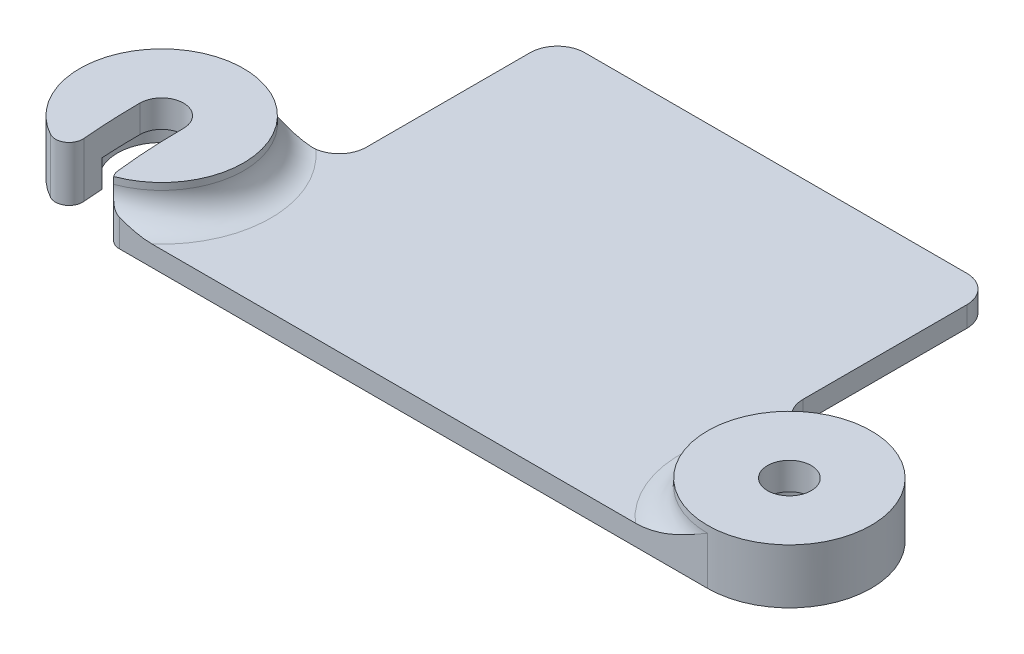
ISO-10303-21;
HEADER;
FILE_DESCRIPTION(('STEP AP214'),'2;1');
FILE_NAME('part.step','',(''),(''),'','','');
FILE_SCHEMA(('AUTOMOTIVE_DESIGN { 1 0 10303 214 1 1 1 1 }'));
ENDSEC;
DATA;
#1=APPLICATION_CONTEXT('core data for automotive mechanical design processes');
#2=APPLICATION_PROTOCOL_DEFINITION('international standard','automotive_design',2000,#1);
#3=PRODUCT_CONTEXT('',#1,'mechanical');
#4=PRODUCT('Part','Part','',(#3));
#5=PRODUCT_RELATED_PRODUCT_CATEGORY('part','',(#4));
#6=PRODUCT_DEFINITION_FORMATION('','',#4);
#7=PRODUCT_DEFINITION_CONTEXT('part definition',#1,'design');
#8=PRODUCT_DEFINITION('design','',#6,#7);
#9=PRODUCT_DEFINITION_SHAPE('','',#8);
#10=(LENGTH_UNIT() NAMED_UNIT(*) SI_UNIT(.MILLI.,.METRE.));
#11=(NAMED_UNIT(*) PLANE_ANGLE_UNIT() SI_UNIT($,.RADIAN.));
#12=(NAMED_UNIT(*) SI_UNIT($,.STERADIAN.) SOLID_ANGLE_UNIT());
#13=UNCERTAINTY_MEASURE_WITH_UNIT(LENGTH_MEASURE(1.E-05),#10,'distance_accuracy_value','');
#14=(GEOMETRIC_REPRESENTATION_CONTEXT(3) GLOBAL_UNCERTAINTY_ASSIGNED_CONTEXT((#13)) GLOBAL_UNIT_ASSIGNED_CONTEXT((#10,
#11,#12)) REPRESENTATION_CONTEXT('',''));
#15=CARTESIAN_POINT('',(0.,0.,0.));
#16=DIRECTION('',(0.,0.,1.));
#17=DIRECTION('',(1.,0.,0.));
#18=AXIS2_PLACEMENT_3D('',#15,#16,#17);
#19=CARTESIAN_POINT('',(0.,1.5,0.));
#20=DIRECTION('',(0.,1.,0.));
#21=DIRECTION('',(0.,0.,1.));
#22=AXIS2_PLACEMENT_3D('',#19,#20,#21);
#23=PLANE('',#22);
#24=DIRECTION('',(-1.,0.,0.));
#25=VECTOR('',#24,1.);
#26=CARTESIAN_POINT('',(-16.,1.5,-28.));
#27=LINE('',#26,#25);
#28=CARTESIAN_POINT('',(14.,1.5,-28.));
#29=VERTEX_POINT('',#28);
#30=CARTESIAN_POINT('',(-14.,1.5,-28.));
#31=VERTEX_POINT('',#30);
#32=EDGE_CURVE('E409',#29,#31,#27,.T.);
#33=ORIENTED_EDGE('',*,*,#32,.T.);
#34=CARTESIAN_POINT('',(-14.,1.5,-26.));
#35=DIRECTION('',(0.,1.,0.));
#36=DIRECTION('',(0.,0.,1.));
#37=AXIS2_PLACEMENT_3D('',#34,#35,#36);
#38=CIRCLE('',#37,2.);
#39=CARTESIAN_POINT('',(-16.,1.5,-26.));
#40=VERTEX_POINT('',#39);
#41=EDGE_CURVE('E459',#31,#40,#38,.T.);
#42=ORIENTED_EDGE('',*,*,#41,.T.);
#43=DIRECTION('',(0.,0.,1.));
#44=VECTOR('',#43,1.);
#45=CARTESIAN_POINT('',(-16.,1.5,-28.));
#46=LINE('',#45,#44);
#47=CARTESIAN_POINT('',(-16.,1.5,-14.));
#48=VERTEX_POINT('',#47);
#49=EDGE_CURVE('E402',#40,#48,#46,.T.);
#50=ORIENTED_EDGE('',*,*,#49,.T.);
#51=CARTESIAN_POINT('',(-18.,1.5,-14.));
#52=DIRECTION('',(0.,1.,0.));
#53=DIRECTION('',(0.,0.,1.));
#54=AXIS2_PLACEMENT_3D('',#51,#52,#53);
#55=CIRCLE('',#54,2.);
#56=CARTESIAN_POINT('',(-17.7294205422337,1.5,-12.0183878388961));
#57=VERTEX_POINT('',#56);
#58=EDGE_CURVE('E433',#48,#57,#55,.F.);
#59=ORIENTED_EDGE('',*,*,#58,.T.);
#60=CARTESIAN_POINT('',(-23.,1.5,-5.99999999999999));
#61=DIRECTION('',(0.,1.,0.));
#62=DIRECTION('',(0.,0.,1.));
#63=AXIS2_PLACEMENT_3D('',#60,#61,#62);
#64=CIRCLE('',#63,8.);
#65=CARTESIAN_POINT('',(-17.7084973778708,1.5,0.));
#66=VERTEX_POINT('',#65);
#67=EDGE_CURVE('E452',#57,#66,#64,.F.);
#68=ORIENTED_EDGE('',*,*,#67,.T.);
#69=DIRECTION('',(1.,0.,0.));
#70=VECTOR('',#69,1.);
#71=CARTESIAN_POINT('',(-16.,1.5,0.));
#72=LINE('',#71,#70);
#73=CARTESIAN_POINT('',(17.7084973778708,1.5,0.));
#74=VERTEX_POINT('',#73);
#75=EDGE_CURVE('E347',#66,#74,#72,.T.);
#76=ORIENTED_EDGE('',*,*,#75,.T.);
#77=CARTESIAN_POINT('',(23.,1.5,-5.99999999999999));
#78=DIRECTION('',(0.,1.,0.));
#79=DIRECTION('',(0.,0.,1.));
#80=AXIS2_PLACEMENT_3D('',#77,#78,#79);
#81=CIRCLE('',#80,8.);
#82=CARTESIAN_POINT('',(17.7294205422337,1.5,-12.0183878388961));
#83=VERTEX_POINT('',#82);
#84=EDGE_CURVE('E454',#74,#83,#81,.F.);
#85=ORIENTED_EDGE('',*,*,#84,.T.);
#86=CARTESIAN_POINT('',(18.,1.5,-14.));
#87=DIRECTION('',(0.,1.,0.));
#88=DIRECTION('',(0.,0.,1.));
#89=AXIS2_PLACEMENT_3D('',#86,#87,#88);
#90=CIRCLE('',#89,2.);
#91=CARTESIAN_POINT('',(16.,1.5,-14.));
#92=VERTEX_POINT('',#91);
#93=EDGE_CURVE('E436',#83,#92,#90,.F.);
#94=ORIENTED_EDGE('',*,*,#93,.T.);
#95=DIRECTION('',(0.,0.,-1.));
#96=VECTOR('',#95,1.);
#97=CARTESIAN_POINT('',(16.,1.5,-28.));
#98=LINE('',#97,#96);
#99=CARTESIAN_POINT('',(16.,1.5,-26.));
#100=VERTEX_POINT('',#99);
#101=EDGE_CURVE('E406',#92,#100,#98,.T.);
#102=ORIENTED_EDGE('',*,*,#101,.T.);
#103=CARTESIAN_POINT('',(14.,1.5,-26.));
#104=DIRECTION('',(0.,1.,0.));
#105=DIRECTION('',(0.,0.,1.));
#106=AXIS2_PLACEMENT_3D('',#103,#104,#105);
#107=CIRCLE('',#106,2.);
#108=EDGE_CURVE('E457',#100,#29,#107,.T.);
#109=ORIENTED_EDGE('',*,*,#108,.T.);
#110=EDGE_LOOP('',(#33,#42,#50,#59,#68,#76,#85,#94,#102,#109));
#111=FACE_BOUND('',#110,.T.);
#112=ADVANCED_FACE('F32',(#111),#23,.T.);
#113=CARTESIAN_POINT('',(-16.,1.5,-28.));
#114=DIRECTION('',(1.,0.,0.));
#115=DIRECTION('',(0.,0.,-1.));
#116=AXIS2_PLACEMENT_3D('',#113,#114,#115);
#117=PLANE('',#116);
#118=ORIENTED_EDGE('',*,*,#49,.F.);
#119=DIRECTION('',(0.,-1.,0.));
#120=VECTOR('',#119,1.);
#121=CARTESIAN_POINT('',(-16.,1.5,-26.));
#122=LINE('',#121,#120);
#123=CARTESIAN_POINT('',(-16.,0.,-26.));
#124=VERTEX_POINT('',#123);
#125=EDGE_CURVE('E440',#40,#124,#122,.T.);
#126=ORIENTED_EDGE('',*,*,#125,.T.);
#127=DIRECTION('',(0.,0.,1.));
#128=VECTOR('',#127,1.);
#129=CARTESIAN_POINT('',(-16.,0.,-28.));
#130=LINE('',#129,#128);
#131=CARTESIAN_POINT('',(-16.,0.,-14.));
#132=VERTEX_POINT('',#131);
#133=EDGE_CURVE('E387',#124,#132,#130,.T.);
#134=ORIENTED_EDGE('',*,*,#133,.T.);
#135=DIRECTION('',(0.,-1.,0.));
#136=VECTOR('',#135,1.);
#137=CARTESIAN_POINT('',(-16.,1.5,-14.));
#138=LINE('',#137,#136);
#139=EDGE_CURVE('E423',#132,#48,#138,.F.);
#140=ORIENTED_EDGE('',*,*,#139,.T.);
#141=EDGE_LOOP('',(#118,#126,#134,#140));
#142=FACE_BOUND('',#141,.T.);
#143=ADVANCED_FACE('F282',(#142),#117,.F.);
#144=CARTESIAN_POINT('',(16.,1.5,-28.));
#145=DIRECTION('',(-1.,0.,0.));
#146=DIRECTION('',(0.,0.,1.));
#147=AXIS2_PLACEMENT_3D('',#144,#145,#146);
#148=PLANE('',#147);
#149=DIRECTION('',(0.,0.,-1.));
#150=VECTOR('',#149,1.);
#151=CARTESIAN_POINT('',(16.,0.,-28.));
#152=LINE('',#151,#150);
#153=CARTESIAN_POINT('',(16.,0.,-14.));
#154=VERTEX_POINT('',#153);
#155=CARTESIAN_POINT('',(16.,0.,-26.));
#156=VERTEX_POINT('',#155);
#157=EDGE_CURVE('E416',#154,#156,#152,.T.);
#158=ORIENTED_EDGE('',*,*,#157,.T.);
#159=DIRECTION('',(0.,-1.,0.));
#160=VECTOR('',#159,1.);
#161=CARTESIAN_POINT('',(16.,1.5,-26.));
#162=LINE('',#161,#160);
#163=EDGE_CURVE('E461',#156,#100,#162,.F.);
#164=ORIENTED_EDGE('',*,*,#163,.T.);
#165=ORIENTED_EDGE('',*,*,#101,.F.);
#166=DIRECTION('',(0.,1.,0.));
#167=VECTOR('',#166,1.);
#168=CARTESIAN_POINT('',(16.,0.,-14.));
#169=LINE('',#168,#167);
#170=EDGE_CURVE('E428',#92,#154,#169,.F.);
#171=ORIENTED_EDGE('',*,*,#170,.T.);
#172=EDGE_LOOP('',(#158,#164,#165,#171));
#173=FACE_BOUND('',#172,.T.);
#174=ADVANCED_FACE('F335',(#173),#148,.F.);
#175=CARTESIAN_POINT('',(-16.,1.5,0.));
#176=DIRECTION('',(0.,0.,-1.));
#177=DIRECTION('',(-1.,0.,0.));
#178=AXIS2_PLACEMENT_3D('',#175,#176,#177);
#179=PLANE('',#178);
#180=CARTESIAN_POINT('',(-17.7084973778708,1.5,0.));
#181=CARTESIAN_POINT('',(-17.8596589596461,1.50003932371852,0.));
#182=CARTESIAN_POINT('',(-18.0106418495148,1.50749080861612,0.));
#183=CARTESIAN_POINT('',(-18.3111151185735,1.53529748814472,0.));
#184=CARTESIAN_POINT('',(-18.4606079983095,1.55562506504917,0.));
#185=CARTESIAN_POINT('',(-18.7554920498884,1.60690972129928,0.));
#186=CARTESIAN_POINT('',(-18.9009113020027,1.63771036698793,0.));
#187=CARTESIAN_POINT('',(-19.1895608740858,1.70848018103632,0.));
#188=CARTESIAN_POINT('',(-19.332789869831,1.74845467894688,0.));
#189=CARTESIAN_POINT('',(-19.7848653895851,1.88804779430911,0.));
#190=CARTESIAN_POINT('',(-20.0892007685887,2.0022836971662,0.));
#191=CARTESIAN_POINT('',(-20.6872108133199,2.25580816906669,0.));
#192=CARTESIAN_POINT('',(-20.9808727276605,2.3951255919381,0.));
#193=CARTESIAN_POINT('',(-21.8535701638187,2.8381210802857,0.));
#194=CARTESIAN_POINT('',(-22.4203356132407,3.16533067278994,-1.08261691907642E-13));
#195=CARTESIAN_POINT('',(-22.991055752303,3.49483605454635,0.));
#196=CARTESIAN_POINT('',(-22.9955278884057,3.49741804396575,0.));
#197=CARTESIAN_POINT('',(-23.,3.5,0.));
#198=B_SPLINE_CURVE_WITH_KNOTS('',3,(#180,#181,#182,#183,#184,#185,#186,#187,#188,#189,#190,
#191,#192,#193,#194,#195,#196,#197),.UNSPECIFIED.,.F.,.F.,(4,2,2,2,2,2,2,2,4),(0.,
0.453047985176009,0.905127510171501,1.3507312096181,1.79659444088084,2.76988627914111,
3.74430503334465,5.70583133706976,5.7213232705845),.UNSPECIFIED.);
#199=CARTESIAN_POINT('',(-20.1110194729839,2.01591448400353,0.));
#200=VERTEX_POINT('',#199);
#201=EDGE_CURVE('E257',#66,#200,#198,.T.);
#202=ORIENTED_EDGE('',*,*,#201,.T.);
#203=DIRECTION('',(0.,1.,0.));
#204=VECTOR('',#203,1.);
#205=CARTESIAN_POINT('',(-20.1110194729839,1.5,0.));
#206=LINE('',#205,#204);
#207=CARTESIAN_POINT('',(-20.1110194729839,0.,0.));
#208=VERTEX_POINT('',#207);
#209=EDGE_CURVE('E11',#200,#208,#206,.F.);
#210=ORIENTED_EDGE('',*,*,#209,.T.);
#211=DIRECTION('',(1.,0.,0.));
#212=VECTOR('',#211,1.);
#213=CARTESIAN_POINT('',(-16.,0.,0.));
#214=LINE('',#213,#212);
#215=CARTESIAN_POINT('',(23.,0.,0.));
#216=VERTEX_POINT('',#215);
#217=EDGE_CURVE('E414',#208,#216,#214,.T.);
#218=ORIENTED_EDGE('',*,*,#217,.T.);
#219=DIRECTION('',(0.,-1.,0.));
#220=VECTOR('',#219,1.);
#221=CARTESIAN_POINT('',(23.,60.7283715798434,0.));
#222=LINE('',#221,#220);
#223=CARTESIAN_POINT('',(23.,3.5,0.));
#224=VERTEX_POINT('',#223);
#225=EDGE_CURVE('E393',#224,#216,#222,.T.);
#226=ORIENTED_EDGE('',*,*,#225,.F.);
#227=CARTESIAN_POINT('',(17.7084973778708,1.5,0.));
#228=CARTESIAN_POINT('',(17.8596589596462,1.50003932371852,0.));
#229=CARTESIAN_POINT('',(18.0106418495149,1.50749080861612,0.));
#230=CARTESIAN_POINT('',(18.3111151185736,1.53529748814473,0.));
#231=CARTESIAN_POINT('',(18.4606079983096,1.55562506504919,0.));
#232=CARTESIAN_POINT('',(18.7554920498885,1.6069097212993,0.));
#233=CARTESIAN_POINT('',(18.9009113020028,1.63771036698795,0.));
#234=CARTESIAN_POINT('',(19.1895608740858,1.70848018103633,0.));
#235=CARTESIAN_POINT('',(19.332789869831,1.74845467894688,0.));
#236=CARTESIAN_POINT('',(19.7848653895851,1.88804779430911,0.));
#237=CARTESIAN_POINT('',(20.0892007685887,2.00228369716622,0.));
#238=CARTESIAN_POINT('',(20.6872108133199,2.25580816906664,0.));
#239=CARTESIAN_POINT('',(20.9808727276605,2.39512559193796,0.));
#240=CARTESIAN_POINT('',(21.8535701638185,2.8381210802859,0.));
#241=CARTESIAN_POINT('',(22.42033561324,3.16533067279119,-1.08261712199863E-13));
#242=CARTESIAN_POINT('',(22.991055752303,3.49483605454637,0.));
#243=CARTESIAN_POINT('',(22.9955278884057,3.49741804396576,0.));
#244=CARTESIAN_POINT('',(23.,3.5,0.));
#245=B_SPLINE_CURVE_WITH_KNOTS('',3,(#227,#228,#229,#230,#231,#232,#233,#234,#235,#236,#237,
#238,#239,#240,#241,#242,#243,#244),.UNSPECIFIED.,.F.,.F.,(4,2,2,2,2,2,2,2,4),(0.,
0.453047985176086,0.905127510171634,1.35073120961817,1.79659444088084,2.7698862791411,
3.74430503334458,5.70583133706977,5.7213232705845),.UNSPECIFIED.);
#246=EDGE_CURVE('E303',#224,#74,#245,.F.);
#247=ORIENTED_EDGE('',*,*,#246,.T.);
#248=ORIENTED_EDGE('',*,*,#75,.F.);
#249=EDGE_LOOP('',(#202,#210,#218,#226,#247,#248));
#250=FACE_BOUND('',#249,.T.);
#251=ADVANCED_FACE('F333',(#250),#179,.F.);
#252=CARTESIAN_POINT('',(-16.,1.5,-28.));
#253=DIRECTION('',(0.,0.,1.));
#254=DIRECTION('',(1.,0.,0.));
#255=AXIS2_PLACEMENT_3D('',#252,#253,#254);
#256=PLANE('',#255);
#257=DIRECTION('',(-1.,0.,0.));
#258=VECTOR('',#257,1.);
#259=CARTESIAN_POINT('',(-16.,0.,-28.));
#260=LINE('',#259,#258);
#261=CARTESIAN_POINT('',(14.,0.,-28.));
#262=VERTEX_POINT('',#261);
#263=CARTESIAN_POINT('',(-14.,0.,-28.));
#264=VERTEX_POINT('',#263);
#265=EDGE_CURVE('E404',#262,#264,#260,.T.);
#266=ORIENTED_EDGE('',*,*,#265,.T.);
#267=DIRECTION('',(0.,-1.,0.));
#268=VECTOR('',#267,1.);
#269=CARTESIAN_POINT('',(-14.,1.5,-28.));
#270=LINE('',#269,#268);
#271=EDGE_CURVE('E450',#264,#31,#270,.F.);
#272=ORIENTED_EDGE('',*,*,#271,.T.);
#273=ORIENTED_EDGE('',*,*,#32,.F.);
#274=DIRECTION('',(0.,-1.,0.));
#275=VECTOR('',#274,1.);
#276=CARTESIAN_POINT('',(14.,1.5,-28.));
#277=LINE('',#276,#275);
#278=EDGE_CURVE('E447',#29,#262,#277,.T.);
#279=ORIENTED_EDGE('',*,*,#278,.T.);
#280=EDGE_LOOP('',(#266,#272,#273,#279));
#281=FACE_BOUND('',#280,.T.);
#282=ADVANCED_FACE('F330',(#281),#256,.F.);
#283=CARTESIAN_POINT('',(0.,0.,0.));
#284=DIRECTION('',(0.,1.,0.));
#285=DIRECTION('',(0.,0.,1.));
#286=AXIS2_PLACEMENT_3D('',#283,#284,#285);
#287=PLANE('',#286);
#288=CARTESIAN_POINT('',(23.,0.,-5.99999999999999));
#289=DIRECTION('',(0.,1.,0.));
#290=DIRECTION('',(0.,0.,1.));
#291=AXIS2_PLACEMENT_3D('',#288,#289,#290);
#292=CIRCLE('',#291,47.6);
#293=CARTESIAN_POINT('',(-24.5130163043478,0.,-3.1236687147031));
#294=VERTEX_POINT('',#293);
#295=CARTESIAN_POINT('',(-24.4058185721954,0.,-1.70484394927317));
#296=VERTEX_POINT('',#295);
#297=EDGE_CURVE('E357',#294,#296,#292,.T.);
#298=ORIENTED_EDGE('',*,*,#297,.T.);
#299=CARTESIAN_POINT('',(-25.4017391304348,0.,-1.61460957845958));
#300=DIRECTION('',(0.,1.,0.));
#301=DIRECTION('',(0.,0.,1.));
#302=AXIS2_PLACEMENT_3D('',#299,#300,#301);
#303=CIRCLE('',#302,1.);
#304=CARTESIAN_POINT('',(-25.8820869565217,0.,-0.737531494151498));
#305=VERTEX_POINT('',#304);
#306=EDGE_CURVE('E237',#296,#305,#303,.F.);
#307=ORIENTED_EDGE('',*,*,#306,.T.);
#308=CARTESIAN_POINT('',(-23.,0.,-5.99999999999999));
#309=DIRECTION('',(0.,1.,0.));
#310=DIRECTION('',(0.,0.,1.));
#311=AXIS2_PLACEMENT_3D('',#308,#309,#310);
#312=CIRCLE('',#311,6.);
#313=CARTESIAN_POINT('',(-23.,0.,-12.));
#314=VERTEX_POINT('',#313);
#315=EDGE_CURVE('E394',#314,#305,#312,.T.);
#316=ORIENTED_EDGE('',*,*,#315,.F.);
#317=DIRECTION('',(-1.,0.,0.));
#318=VECTOR('',#317,1.);
#319=CARTESIAN_POINT('',(-23.,0.,-12.));
#320=LINE('',#319,#318);
#321=CARTESIAN_POINT('',(-18.,0.,-12.));
#322=VERTEX_POINT('',#321);
#323=EDGE_CURVE('E388',#322,#314,#320,.T.);
#324=ORIENTED_EDGE('',*,*,#323,.F.);
#325=CARTESIAN_POINT('',(-18.,0.,-14.));
#326=DIRECTION('',(0.,1.,0.));
#327=DIRECTION('',(0.,0.,1.));
#328=AXIS2_PLACEMENT_3D('',#325,#326,#327);
#329=CIRCLE('',#328,2.);
#330=EDGE_CURVE('E430',#322,#132,#329,.T.);
#331=ORIENTED_EDGE('',*,*,#330,.T.);
#332=ORIENTED_EDGE('',*,*,#133,.F.);
#333=CARTESIAN_POINT('',(-14.,0.,-26.));
#334=DIRECTION('',(0.,1.,0.));
#335=DIRECTION('',(0.,0.,1.));
#336=AXIS2_PLACEMENT_3D('',#333,#334,#335);
#337=CIRCLE('',#336,2.);
#338=EDGE_CURVE('E445',#124,#264,#337,.F.);
#339=ORIENTED_EDGE('',*,*,#338,.T.);
#340=ORIENTED_EDGE('',*,*,#265,.F.);
#341=CARTESIAN_POINT('',(14.,0.,-26.));
#342=DIRECTION('',(0.,1.,0.));
#343=DIRECTION('',(0.,0.,1.));
#344=AXIS2_PLACEMENT_3D('',#341,#342,#343);
#345=CIRCLE('',#344,2.);
#346=EDGE_CURVE('E443',#262,#156,#345,.F.);
#347=ORIENTED_EDGE('',*,*,#346,.T.);
#348=ORIENTED_EDGE('',*,*,#157,.F.);
#349=CARTESIAN_POINT('',(18.,0.,-14.));
#350=DIRECTION('',(0.,1.,0.));
#351=DIRECTION('',(0.,0.,1.));
#352=AXIS2_PLACEMENT_3D('',#349,#350,#351);
#353=CIRCLE('',#352,2.);
#354=CARTESIAN_POINT('',(18.,0.,-12.));
#355=VERTEX_POINT('',#354);
#356=EDGE_CURVE('E438',#154,#355,#353,.T.);
#357=ORIENTED_EDGE('',*,*,#356,.T.);
#358=CARTESIAN_POINT('',(23.,0.,-12.));
#359=VERTEX_POINT('',#358);
#360=EDGE_CURVE('E384',#359,#355,#320,.T.);
#361=ORIENTED_EDGE('',*,*,#360,.F.);
#362=CARTESIAN_POINT('',(23.,0.,-5.99999999999999));
#363=DIRECTION('',(0.,1.,0.));
#364=DIRECTION('',(0.,0.,1.));
#365=AXIS2_PLACEMENT_3D('',#362,#363,#364);
#366=CIRCLE('',#365,6.);
#367=EDGE_CURVE('E389',#216,#359,#366,.T.);
#368=ORIENTED_EDGE('',*,*,#367,.F.);
#369=ORIENTED_EDGE('',*,*,#217,.F.);
#370=CARTESIAN_POINT('',(-20.1110194729839,0.,-1.));
#371=DIRECTION('',(0.,1.,0.));
#372=DIRECTION('',(0.,0.,1.));
#373=AXIS2_PLACEMENT_3D('',#370,#371,#372);
#374=CIRCLE('',#373,1.);
#375=CARTESIAN_POINT('',(-21.1043609354951,0.,-0.884792626728111));
#376=VERTEX_POINT('',#375);
#377=EDGE_CURVE('E55',#208,#376,#374,.F.);
#378=ORIENTED_EDGE('',*,*,#377,.T.);
#379=CARTESIAN_POINT('',(23.,0.,-5.99999999999999));
#380=DIRECTION('',(0.,-1.,0.));
#381=DIRECTION('',(0.,0.,1.));
#382=AXIS2_PLACEMENT_3D('',#379,#380,#381);
#383=CIRCLE('',#382,44.4);
#384=CARTESIAN_POINT('',(-21.3130163043478,0.,-3.22212563088195));
#385=VERTEX_POINT('',#384);
#386=EDGE_CURVE('E194',#376,#385,#383,.T.);
#387=ORIENTED_EDGE('',*,*,#386,.T.);
#388=CARTESIAN_POINT('',(-23.,0.,-5.99999999999999));
#389=DIRECTION('',(0.,-1.,0.));
#390=DIRECTION('',(0.,0.,-1.));
#391=AXIS2_PLACEMENT_3D('',#388,#389,#390);
#392=CIRCLE('',#391,3.25);
#393=EDGE_CURVE('E368',#294,#385,#392,.T.);
#394=ORIENTED_EDGE('',*,*,#393,.F.);
#395=EDGE_LOOP('',(#298,#307,#316,#324,#331,#332,#339,#340,#347,#348,#357,#361,#368,#369,#378,
#387,#394));
#396=FACE_BOUND('',#395,.T.);
#397=CARTESIAN_POINT('',(23.,0.,-5.99999999999999));
#398=DIRECTION('',(0.,-1.,0.));
#399=DIRECTION('',(0.,0.,-1.));
#400=AXIS2_PLACEMENT_3D('',#397,#398,#399);
#401=CIRCLE('',#400,3.25);
#402=CARTESIAN_POINT('',(23.,0.,-9.24999999999999));
#403=VERTEX_POINT('',#402);
#404=EDGE_CURVE('E207',#403,#403,#401,.T.);
#405=ORIENTED_EDGE('',*,*,#404,.F.);
#406=EDGE_LOOP('',(#405));
#407=FACE_BOUND('',#406,.T.);
#408=ADVANCED_FACE('F320',(#396,#407),#287,.F.);
#409=CARTESIAN_POINT('',(23.,60.7283715798434,-5.99999999999999));
#410=DIRECTION('',(0.,-1.,0.));
#411=DIRECTION('',(0.,0.,-1.));
#412=AXIS2_PLACEMENT_3D('',#409,#410,#411);
#413=CYLINDRICAL_SURFACE('',#412,6.);
#414=DIRECTION('',(0.,-1.,0.));
#415=VECTOR('',#414,1.);
#416=CARTESIAN_POINT('',(23.,60.7283715798434,-12.));
#417=LINE('',#416,#415);
#418=CARTESIAN_POINT('',(23.,3.5,-12.));
#419=VERTEX_POINT('',#418);
#420=EDGE_CURVE('E392',#419,#359,#417,.T.);
#421=ORIENTED_EDGE('',*,*,#420,.F.);
#422=CARTESIAN_POINT('',(23.,3.5,-5.99999999999999));
#423=DIRECTION('',(0.,1.,0.));
#424=DIRECTION('',(0.,0.,1.));
#425=AXIS2_PLACEMENT_3D('',#422,#423,#424);
#426=CIRCLE('',#425,6.);
#427=EDGE_CURVE('E462',#419,#224,#426,.T.);
#428=ORIENTED_EDGE('',*,*,#427,.T.);
#429=ORIENTED_EDGE('',*,*,#225,.T.);
#430=ORIENTED_EDGE('',*,*,#367,.T.);
#431=EDGE_LOOP('',(#421,#428,#429,#430));
#432=FACE_BOUND('',#431,.T.);
#433=CARTESIAN_POINT('',(23.,4.,-5.99999999999999));
#434=DIRECTION('',(0.,1.,0.));
#435=DIRECTION('',(0.,0.,1.));
#436=AXIS2_PLACEMENT_3D('',#433,#434,#435);
#437=CIRCLE('',#436,6.);
#438=CARTESIAN_POINT('',(23.,4.,0.));
#439=VERTEX_POINT('',#438);
#440=EDGE_CURVE('E378',#439,#439,#437,.T.);
#441=ORIENTED_EDGE('',*,*,#440,.F.);
#442=EDGE_LOOP('',(#441));
#443=FACE_BOUND('',#442,.T.);
#444=ADVANCED_FACE('F316',(#432,#443),#413,.T.);
#445=CARTESIAN_POINT('',(-23.,60.7283715798434,-12.));
#446=DIRECTION('',(0.,0.,1.));
#447=DIRECTION('',(1.,0.,0.));
#448=AXIS2_PLACEMENT_3D('',#445,#446,#447);
#449=PLANE('',#448);
#450=ORIENTED_EDGE('',*,*,#360,.T.);
#451=DIRECTION('',(0.,1.,0.));
#452=VECTOR('',#451,1.);
#453=CARTESIAN_POINT('',(18.,1.5,-12.));
#454=LINE('',#453,#452);
#455=CARTESIAN_POINT('',(18.,1.509021643888,-12.));
#456=VERTEX_POINT('',#455);
#457=EDGE_CURVE('E426',#355,#456,#454,.T.);
#458=ORIENTED_EDGE('',*,*,#457,.T.);
#459=CARTESIAN_POINT('',(18.,1.509021643888,-12.));
#460=CARTESIAN_POINT('',(18.1652056903618,1.51915099877761,-12.));
#461=CARTESIAN_POINT('',(18.3297113402675,1.53733944321906,-12.));
#462=CARTESIAN_POINT('',(18.6562591549016,1.58751246522998,-12.));
#463=CARTESIAN_POINT('',(18.8183060052501,1.6194661057526,-12.));
#464=CARTESIAN_POINT('',(19.1376370689058,1.69444797831192,-12.));
#465=CARTESIAN_POINT('',(19.2949553689247,1.73733481511474,-12.));
#466=CARTESIAN_POINT('',(19.6067765369496,1.83257358289103,-12.));
#467=CARTESIAN_POINT('',(19.7612775786725,1.8849314289971,-12.));
#468=CARTESIAN_POINT('',(20.183196610141,2.04003537168637,-12.));
#469=CARTESIAN_POINT('',(20.4476066766373,2.15093384125717,-12.));
#470=CARTESIAN_POINT('',(20.9687226872726,2.38941023467537,-12.));
#471=CARTESIAN_POINT('',(21.2254251266692,2.51699560913509,-12.));
#472=CARTESIAN_POINT('',(21.9893630358611,2.9165914294038,-12.));
#473=CARTESIAN_POINT('',(22.488123996533,3.20446898333212,-12.));
#474=CARTESIAN_POINT('',(22.9910557441195,3.49483604443316,-12.));
#475=CARTESIAN_POINT('',(22.9955278802297,3.49741803359013,-12.));
#476=CARTESIAN_POINT('',(23.,3.5,-12.));
#477=B_SPLINE_CURVE_WITH_KNOTS('',3,(#459,#460,#461,#462,#463,#464,#465,#466,#467,#468,#469,
#470,#471,#472,#473,#474,#475,#476),.UNSPECIFIED.,.F.,.F.,(4,2,2,2,2,2,2,2,4),(0.,
0.496054106430505,0.990999108925377,1.4798419550864,1.96899116955172,2.82822161379766,
3.68783701787667,5.41454225246469,5.43003418584954),.UNSPECIFIED.);
#478=EDGE_CURVE('E296',#456,#419,#477,.T.);
#479=ORIENTED_EDGE('',*,*,#478,.T.);
#480=ORIENTED_EDGE('',*,*,#420,.T.);
#481=EDGE_LOOP('',(#450,#458,#479,#480));
#482=FACE_BOUND('',#481,.T.);
#483=ADVANCED_FACE('F313',(#482),#449,.F.);
#484=DIRECTION('',(0.,-1.,0.));
#485=VECTOR('',#484,1.);
#486=CARTESIAN_POINT('',(-23.,60.7283715798434,-12.));
#487=LINE('',#486,#485);
#488=CARTESIAN_POINT('',(-23.,3.5,-12.));
#489=VERTEX_POINT('',#488);
#490=EDGE_CURVE('E383',#489,#314,#487,.T.);
#491=ORIENTED_EDGE('',*,*,#490,.F.);
#492=CARTESIAN_POINT('',(-18.,1.509021643888,-12.));
#493=CARTESIAN_POINT('',(-18.1652056903618,1.51915099877761,-12.));
#494=CARTESIAN_POINT('',(-18.3297113402675,1.53733944321906,-12.));
#495=CARTESIAN_POINT('',(-18.6562591549016,1.58751246522998,-12.));
#496=CARTESIAN_POINT('',(-18.8183060052501,1.6194661057526,-12.));
#497=CARTESIAN_POINT('',(-19.1376370689058,1.69444797831192,-12.));
#498=CARTESIAN_POINT('',(-19.2949553689247,1.73733481511474,-12.));
#499=CARTESIAN_POINT('',(-19.6067765369496,1.83257358289103,-12.));
#500=CARTESIAN_POINT('',(-19.7612775786725,1.8849314289971,-12.));
#501=CARTESIAN_POINT('',(-20.183196610141,2.04003537168637,-12.));
#502=CARTESIAN_POINT('',(-20.4476066766373,2.15093384125717,-12.));
#503=CARTESIAN_POINT('',(-20.9687226872726,2.38941023467537,-12.));
#504=CARTESIAN_POINT('',(-21.2254251266692,2.51699560913509,-12.));
#505=CARTESIAN_POINT('',(-21.9893630358611,2.9165914294038,-12.));
#506=CARTESIAN_POINT('',(-22.488123996533,3.20446898333212,-12.));
#507=CARTESIAN_POINT('',(-22.9910557441195,3.49483604443316,-12.));
#508=CARTESIAN_POINT('',(-22.9955278802297,3.49741803359013,-12.));
#509=CARTESIAN_POINT('',(-23.,3.5,-12.));
#510=B_SPLINE_CURVE_WITH_KNOTS('',3,(#492,#493,#494,#495,#496,#497,#498,#499,#500,#501,#502,
#503,#504,#505,#506,#507,#508,#509),.UNSPECIFIED.,.F.,.F.,(4,2,2,2,2,2,2,2,4),(0.,
0.496054106430505,0.990999108925377,1.4798419550864,1.96899116955172,2.82822161379766,
3.68783701787667,5.41454225246469,5.43003418584954),.UNSPECIFIED.);
#511=CARTESIAN_POINT('',(-18.,1.509021643888,-12.));
#512=VERTEX_POINT('',#511);
#513=EDGE_CURVE('E265',#489,#512,#510,.F.);
#514=ORIENTED_EDGE('',*,*,#513,.T.);
#515=DIRECTION('',(0.,-1.,0.));
#516=VECTOR('',#515,1.);
#517=CARTESIAN_POINT('',(-18.,0.,-12.));
#518=LINE('',#517,#516);
#519=EDGE_CURVE('E412',#512,#322,#518,.T.);
#520=ORIENTED_EDGE('',*,*,#519,.T.);
#521=ORIENTED_EDGE('',*,*,#323,.T.);
#522=EDGE_LOOP('',(#491,#514,#520,#521));
#523=FACE_BOUND('',#522,.T.);
#524=ADVANCED_FACE('F307',(#523),#449,.F.);
#525=CARTESIAN_POINT('',(-23.,60.7283715798434,-5.99999999999999));
#526=DIRECTION('',(0.,-1.,0.));
#527=DIRECTION('',(0.,0.,-1.));
#528=AXIS2_PLACEMENT_3D('',#525,#526,#527);
#529=CYLINDRICAL_SURFACE('',#528,6.);
#530=ORIENTED_EDGE('',*,*,#315,.T.);
#531=DIRECTION('',(0.,-1.,0.));
#532=VECTOR('',#531,1.);
#533=CARTESIAN_POINT('',(-25.8820869565217,60.7283715798434,-0.737531494151497));
#534=LINE('',#533,#532);
#535=CARTESIAN_POINT('',(-25.8820869565217,4.,-0.737531494151498));
#536=VERTEX_POINT('',#535);
#537=EDGE_CURVE('E228',#305,#536,#534,.F.);
#538=ORIENTED_EDGE('',*,*,#537,.T.);
#539=CARTESIAN_POINT('',(-23.,4.,-5.99999999999999));
#540=DIRECTION('',(0.,1.,0.));
#541=DIRECTION('',(0.,0.,1.));
#542=AXIS2_PLACEMENT_3D('',#539,#540,#541);
#543=CIRCLE('',#542,6.);
#544=CARTESIAN_POINT('',(-20.8963156773177,4.,-0.380879760095827));
#545=VERTEX_POINT('',#544);
#546=EDGE_CURVE('E381',#545,#536,#543,.T.);
#547=ORIENTED_EDGE('',*,*,#546,.F.);
#548=DIRECTION('',(0.,-1.,0.));
#549=VECTOR('',#548,1.);
#550=CARTESIAN_POINT('',(-20.8963156773177,4.,-0.380879760095826));
#551=LINE('',#550,#549);
#552=CARTESIAN_POINT('',(-20.8963156773177,3.5,-0.380879760095826));
#553=VERTEX_POINT('',#552);
#554=EDGE_CURVE('E226',#545,#553,#551,.T.);
#555=ORIENTED_EDGE('',*,*,#554,.T.);
#556=CARTESIAN_POINT('',(-23.,3.5,-5.99999999999999));
#557=DIRECTION('',(0.,1.,0.));
#558=DIRECTION('',(0.,0.,1.));
#559=AXIS2_PLACEMENT_3D('',#556,#557,#558);
#560=CIRCLE('',#559,6.);
#561=EDGE_CURVE('E297',#553,#489,#560,.T.);
#562=ORIENTED_EDGE('',*,*,#561,.T.);
#563=ORIENTED_EDGE('',*,*,#490,.T.);
#564=EDGE_LOOP('',(#530,#538,#547,#555,#562,#563));
#565=FACE_BOUND('',#564,.T.);
#566=ADVANCED_FACE('F312',(#565),#529,.T.);
#567=CARTESIAN_POINT('',(-23.,4.,-5.99999999999999));
#568=DIRECTION('',(0.,1.,0.));
#569=DIRECTION('',(0.,0.,1.));
#570=AXIS2_PLACEMENT_3D('',#567,#568,#569);
#571=PLANE('',#570);
#572=ORIENTED_EDGE('',*,*,#546,.T.);
#573=CARTESIAN_POINT('',(-25.4017391304348,4.,-1.61460957845958));
#574=DIRECTION('',(0.,1.,0.));
#575=DIRECTION('',(0.,0.,1.));
#576=AXIS2_PLACEMENT_3D('',#573,#574,#575);
#577=CIRCLE('',#576,1.);
#578=CARTESIAN_POINT('',(-24.4058185721954,4.,-1.70484394927317));
#579=VERTEX_POINT('',#578);
#580=EDGE_CURVE('E202',#536,#579,#577,.T.);
#581=ORIENTED_EDGE('',*,*,#580,.T.);
#582=CARTESIAN_POINT('',(23.,4.,-5.99999999999999));
#583=DIRECTION('',(0.,1.,0.));
#584=DIRECTION('',(0.,0.,1.));
#585=AXIS2_PLACEMENT_3D('',#582,#583,#584);
#586=CIRCLE('',#585,47.6);
#587=CARTESIAN_POINT('',(-24.6,4.,-6.));
#588=VERTEX_POINT('',#587);
#589=EDGE_CURVE('E185',#588,#579,#586,.T.);
#590=ORIENTED_EDGE('',*,*,#589,.F.);
#591=CARTESIAN_POINT('',(-23.,4.,-5.99999999999999));
#592=DIRECTION('',(0.,1.,0.));
#593=DIRECTION('',(0.,0.,1.));
#594=AXIS2_PLACEMENT_3D('',#591,#592,#593);
#595=CIRCLE('',#594,1.6);
#596=CARTESIAN_POINT('',(-21.4,4.,-6.));
#597=VERTEX_POINT('',#596);
#598=EDGE_CURVE('E201',#597,#588,#595,.T.);
#599=ORIENTED_EDGE('',*,*,#598,.F.);
#600=CARTESIAN_POINT('',(23.,4.,-5.99999999999999));
#601=DIRECTION('',(0.,-1.,0.));
#602=DIRECTION('',(0.,0.,1.));
#603=AXIS2_PLACEMENT_3D('',#600,#601,#602);
#604=CIRCLE('',#603,44.4);
#605=CARTESIAN_POINT('',(-21.1043609354951,4.,-0.884792626728111));
#606=VERTEX_POINT('',#605);
#607=EDGE_CURVE('E203',#606,#597,#604,.T.);
#608=ORIENTED_EDGE('',*,*,#607,.F.);
#609=CARTESIAN_POINT('',(-20.1110194729839,4.,-1.));
#610=DIRECTION('',(0.,1.,0.));
#611=DIRECTION('',(0.,0.,1.));
#612=AXIS2_PLACEMENT_3D('',#609,#610,#611);
#613=CIRCLE('',#612,1.);
#614=EDGE_CURVE('E231',#606,#545,#613,.T.);
#615=ORIENTED_EDGE('',*,*,#614,.T.);
#616=EDGE_LOOP('',(#572,#581,#590,#599,#608,#615));
#617=FACE_BOUND('',#616,.T.);
#618=ADVANCED_FACE('F199',(#617),#571,.T.);
#619=CARTESIAN_POINT('',(23.,4.,-5.99999999999999));
#620=DIRECTION('',(0.,1.,0.));
#621=DIRECTION('',(0.,0.,1.));
#622=AXIS2_PLACEMENT_3D('',#619,#620,#621);
#623=PLANE('',#622);
#624=CARTESIAN_POINT('',(23.,4.,-5.99999999999999));
#625=DIRECTION('',(0.,1.,0.));
#626=DIRECTION('',(0.,0.,1.));
#627=AXIS2_PLACEMENT_3D('',#624,#625,#626);
#628=CIRCLE('',#627,1.6);
#629=CARTESIAN_POINT('',(23.,4.,-4.39999999999999));
#630=VERTEX_POINT('',#629);
#631=EDGE_CURVE('E217',#630,#630,#628,.T.);
#632=ORIENTED_EDGE('',*,*,#631,.F.);
#633=EDGE_LOOP('',(#632));
#634=FACE_BOUND('',#633,.T.);
#635=ORIENTED_EDGE('',*,*,#440,.T.);
#636=EDGE_LOOP('',(#635));
#637=FACE_BOUND('',#636,.T.);
#638=ADVANCED_FACE('F280',(#634,#637),#623,.T.);
#639=CARTESIAN_POINT('',(-18.,60.7283715798434,-14.));
#640=DIRECTION('',(0.,1.,0.));
#641=DIRECTION('',(0.,0.,1.));
#642=AXIS2_PLACEMENT_3D('',#639,#640,#641);
#643=CYLINDRICAL_SURFACE('',#642,2.);
#644=ORIENTED_EDGE('',*,*,#58,.F.);
#645=ORIENTED_EDGE('',*,*,#139,.F.);
#646=ORIENTED_EDGE('',*,*,#330,.F.);
#647=ORIENTED_EDGE('',*,*,#519,.F.);
#648=CARTESIAN_POINT('',(-18.,1.509021643888,-12.));
#649=CARTESIAN_POINT('',(-17.9773934294348,1.50764230091445,-11.9999998179888));
#650=CARTESIAN_POINT('',(-17.9547785674258,1.50638820446714,-12.0003832993086));
#651=CARTESIAN_POINT('',(-17.9095916525945,1.50417960336265,-12.0019167914598));
#652=CARTESIAN_POINT('',(-17.887019583777,1.50322468744858,-12.0030657432097));
#653=CARTESIAN_POINT('',(-17.8419145535139,1.50165945753802,-12.0061294133944));
#654=CARTESIAN_POINT('',(-17.8193815929685,1.50104915137296,-12.0080441492305));
#655=CARTESIAN_POINT('',(-17.7743554562393,1.50021906346141,-12.0126405306917));
#656=CARTESIAN_POINT('',(-17.7518623781374,1.4999998228308,-12.0153232330059));
#657=CARTESIAN_POINT('',(-17.7294205422337,1.5,-12.0183878388961));
#658=B_SPLINE_CURVE_WITH_KNOTS('',3,(#648,#649,#650,#651,#652,#653,#654,#655,#656,#657),
.UNSPECIFIED.,.F.,.F.,(4,2,2,2,4),(0.,0.0679431873949978,0.135792565348416,0.203643485151995,
0.27158821739578),.UNSPECIFIED.);
#659=EDGE_CURVE('E223',#512,#57,#658,.T.);
#660=ORIENTED_EDGE('',*,*,#659,.T.);
#661=EDGE_LOOP('',(#644,#645,#646,#647,#660));
#662=FACE_BOUND('',#661,.T.);
#663=ADVANCED_FACE('F274',(#662),#643,.F.);
#664=CARTESIAN_POINT('',(18.,60.7283715798434,-14.));
#665=DIRECTION('',(0.,-1.,0.));
#666=DIRECTION('',(0.,0.,-1.));
#667=AXIS2_PLACEMENT_3D('',#664,#665,#666);
#668=CYLINDRICAL_SURFACE('',#667,2.);
#669=ORIENTED_EDGE('',*,*,#356,.F.);
#670=ORIENTED_EDGE('',*,*,#170,.F.);
#671=ORIENTED_EDGE('',*,*,#93,.F.);
#672=CARTESIAN_POINT('',(17.7294205422337,1.5,-12.0183878388961));
#673=CARTESIAN_POINT('',(17.7518623781374,1.4999998228308,-12.0153232330059));
#674=CARTESIAN_POINT('',(17.7743554562393,1.50021906346141,-12.0126405306917));
#675=CARTESIAN_POINT('',(17.8193815929685,1.50104915137296,-12.0080441492305));
#676=CARTESIAN_POINT('',(17.8419145535139,1.50165945753802,-12.0061294133944));
#677=CARTESIAN_POINT('',(17.887019583777,1.50322468744858,-12.0030657432097));
#678=CARTESIAN_POINT('',(17.9095916525945,1.50417960336265,-12.0019167914598));
#679=CARTESIAN_POINT('',(17.9547785674258,1.50638820446714,-12.0003832993086));
#680=CARTESIAN_POINT('',(17.9773934294348,1.50764230091445,-11.9999998179888));
#681=CARTESIAN_POINT('',(18.,1.509021643888,-12.));
#682=B_SPLINE_CURVE_WITH_KNOTS('',3,(#672,#673,#674,#675,#676,#677,#678,#679,#680,#681),
.UNSPECIFIED.,.F.,.F.,(4,2,2,2,4),(0.,0.0679447322437852,0.13579565204736,0.203645030000775,
0.271588217395773),.UNSPECIFIED.);
#683=EDGE_CURVE('E289',#83,#456,#682,.T.);
#684=ORIENTED_EDGE('',*,*,#683,.T.);
#685=ORIENTED_EDGE('',*,*,#457,.F.);
#686=EDGE_LOOP('',(#669,#670,#671,#684,#685));
#687=FACE_BOUND('',#686,.T.);
#688=ADVANCED_FACE('F279',(#687),#668,.F.);
#689=CARTESIAN_POINT('',(-14.,1.5,-26.));
#690=DIRECTION('',(0.,-1.,0.));
#691=DIRECTION('',(0.,0.,-1.));
#692=AXIS2_PLACEMENT_3D('',#689,#690,#691);
#693=CYLINDRICAL_SURFACE('',#692,2.);
#694=ORIENTED_EDGE('',*,*,#41,.F.);
#695=ORIENTED_EDGE('',*,*,#271,.F.);
#696=ORIENTED_EDGE('',*,*,#338,.F.);
#697=ORIENTED_EDGE('',*,*,#125,.F.);
#698=EDGE_LOOP('',(#694,#695,#696,#697));
#699=FACE_BOUND('',#698,.T.);
#700=ADVANCED_FACE('F286',(#699),#693,.T.);
#701=CARTESIAN_POINT('',(14.,1.5,-26.));
#702=DIRECTION('',(0.,-1.,0.));
#703=DIRECTION('',(0.,0.,-1.));
#704=AXIS2_PLACEMENT_3D('',#701,#702,#703);
#705=CYLINDRICAL_SURFACE('',#704,2.);
#706=ORIENTED_EDGE('',*,*,#108,.F.);
#707=ORIENTED_EDGE('',*,*,#163,.F.);
#708=ORIENTED_EDGE('',*,*,#346,.F.);
#709=ORIENTED_EDGE('',*,*,#278,.F.);
#710=EDGE_LOOP('',(#706,#707,#708,#709));
#711=FACE_BOUND('',#710,.T.);
#712=ADVANCED_FACE('F617',(#711),#705,.T.);
#713=CARTESIAN_POINT('',(23.,3.5,-5.99999999999999));
#714=DIRECTION('',(0.,1.,0.));
#715=DIRECTION('',(0.,0.,1.));
#716=AXIS2_PLACEMENT_3D('',#713,#714,#715);
#717=TOROIDAL_SURFACE('',#716,8.,2.);
#718=ORIENTED_EDGE('',*,*,#246,.F.);
#719=ORIENTED_EDGE('',*,*,#427,.F.);
#720=ORIENTED_EDGE('',*,*,#478,.F.);
#721=ORIENTED_EDGE('',*,*,#683,.F.);
#722=ORIENTED_EDGE('',*,*,#84,.F.);
#723=EDGE_LOOP('',(#718,#719,#720,#721,#722));
#724=FACE_BOUND('',#723,.T.);
#725=ADVANCED_FACE('F250',(#724),#717,.F.);
#726=CARTESIAN_POINT('',(-23.,3.5,-5.99999999999999));
#727=DIRECTION('',(0.,1.,0.));
#728=DIRECTION('',(0.,0.,1.));
#729=AXIS2_PLACEMENT_3D('',#726,#727,#728);
#730=TOROIDAL_SURFACE('',#729,8.,2.);
#731=ORIENTED_EDGE('',*,*,#561,.F.);
#732=CARTESIAN_POINT('',(-20.8963156773177,3.5,-0.380879760095826));
#733=CARTESIAN_POINT('',(-20.8962907607889,3.44764698625846,-0.38089672002688));
#734=CARTESIAN_POINT('',(-20.8949786446376,3.39529158197466,-0.379185489569797));
#735=CARTESIAN_POINT('',(-20.8895984440301,3.2908970399381,-0.37242571740842));
#736=CARTESIAN_POINT('',(-20.8855281287811,3.2388581926125,-0.36737447442888));
#737=CARTESIAN_POINT('',(-20.8744075533053,3.13511321523111,-0.354003776251217));
#738=CARTESIAN_POINT('',(-20.8673350040559,3.08341257214455,-0.345659909424146));
#739=CARTESIAN_POINT('',(-20.8498529250199,2.98118661936248,-0.325984144618721));
#740=CARTESIAN_POINT('',(-20.8394448855478,2.93066079554486,-0.314653581512417));
#741=CARTESIAN_POINT('',(-20.8082372788514,2.80458251787833,-0.282620867767651));
#742=CARTESIAN_POINT('',(-20.784856815697,2.73008412351011,-0.260146262376127));
#743=CARTESIAN_POINT('',(-20.7270898500399,2.58702738650159,-0.211410691039017));
#744=CARTESIAN_POINT('',(-20.692745148371,2.51844772036286,-0.18516431052756));
#745=CARTESIAN_POINT('',(-20.6209792995893,2.40503468474654,-0.139018324533672));
#746=CARTESIAN_POINT('',(-20.5863081756126,2.35846821532397,-0.119118009506504));
#747=CARTESIAN_POINT('',(-20.509166061812,2.27124732393847,-0.0816847115385474));
#748=CARTESIAN_POINT('',(-20.4667133872031,2.23057941311689,-0.0641463340936794));
#749=CARTESIAN_POINT('',(-20.3980129159069,2.17511267519768,-0.041769935880112));
#750=CARTESIAN_POINT('',(-20.374483206692,2.1576642132019,-0.0350051427371946));
#751=CARTESIAN_POINT('',(-20.3258357165197,2.12453162889098,-0.0230246555180999));
#752=CARTESIAN_POINT('',(-20.300718286997,2.10884711825445,-0.0178086200775564));
#753=CARTESIAN_POINT('',(-20.2488158733269,2.07915055021521,-0.00918683285005652));
#754=CARTESIAN_POINT('',(-20.2220148996695,2.06516005201276,-0.00580282796471596));
#755=CARTESIAN_POINT('',(-20.1672827928105,2.03908842152934,-0.00120331142498023));
#756=CARTESIAN_POINT('',(-20.1393503471791,2.02700959121432,9.60371718460227E-06));
#757=CARTESIAN_POINT('',(-20.111019472984,2.0159144840035,0.));
#758=B_SPLINE_CURVE_WITH_KNOTS('',3,(#732,#733,#734,#735,#736,#737,#738,#739,#740,#741,#742,
#743,#744,#745,#746,#747,#748,#749,#750,#751,#752,#753,#754,#755,#756,#757),.UNSPECIFIED.,.F.,
.F.,(4,2,2,2,2,2,2,2,2,2,2,2,4),(0.,0.157018179479509,0.314163504877649,0.472496486642409,
0.630758822803103,0.87359084896396,1.11550792474584,1.29895282060195,1.48197136588948,
1.57205280723964,1.6621143788194,1.75322279754389,1.84444010465779),.UNSPECIFIED.);
#759=EDGE_CURVE('E41',#553,#200,#758,.T.);
#760=ORIENTED_EDGE('',*,*,#759,.T.);
#761=ORIENTED_EDGE('',*,*,#201,.F.);
#762=ORIENTED_EDGE('',*,*,#67,.F.);
#763=ORIENTED_EDGE('',*,*,#659,.F.);
#764=ORIENTED_EDGE('',*,*,#513,.F.);
#765=EDGE_LOOP('',(#731,#760,#761,#762,#763,#764));
#766=FACE_BOUND('',#765,.T.);
#767=ADVANCED_FACE('F245',(#766),#730,.F.);
#768=CARTESIAN_POINT('',(23.,0.,-5.99999999999999));
#769=DIRECTION('',(0.,-1.,0.));
#770=DIRECTION('',(0.,0.,-1.));
#771=AXIS2_PLACEMENT_3D('',#768,#769,#770);
#772=CYLINDRICAL_SURFACE('',#771,1.6);
#773=ORIENTED_EDGE('',*,*,#631,.T.);
#774=EDGE_LOOP('',(#773));
#775=FACE_BOUND('',#774,.T.);
#776=CARTESIAN_POINT('',(23.,2.,-5.99999999999999));
#777=DIRECTION('',(0.,-1.,0.));
#778=DIRECTION('',(0.,0.,-1.));
#779=AXIS2_PLACEMENT_3D('',#776,#777,#778);
#780=CIRCLE('',#779,1.6);
#781=CARTESIAN_POINT('',(23.,2.,-7.59999999999999));
#782=VERTEX_POINT('',#781);
#783=EDGE_CURVE('E375',#782,#782,#780,.T.);
#784=ORIENTED_EDGE('',*,*,#783,.T.);
#785=EDGE_LOOP('',(#784));
#786=FACE_BOUND('',#785,.T.);
#787=ADVANCED_FACE('F249',(#775,#786),#772,.F.);
#788=CARTESIAN_POINT('',(24.6,2.,-5.99999999999999));
#789=DIRECTION('',(0.,1.,0.));
#790=DIRECTION('',(0.,0.,1.));
#791=AXIS2_PLACEMENT_3D('',#788,#789,#790);
#792=PLANE('',#791);
#793=ORIENTED_EDGE('',*,*,#783,.F.);
#794=EDGE_LOOP('',(#793));
#795=FACE_BOUND('',#794,.T.);
#796=CARTESIAN_POINT('',(23.,2.,-5.99999999999999));
#797=DIRECTION('',(0.,-1.,0.));
#798=DIRECTION('',(0.,0.,-1.));
#799=AXIS2_PLACEMENT_3D('',#796,#797,#798);
#800=CIRCLE('',#799,3.25);
#801=CARTESIAN_POINT('',(23.,2.,-9.24999999999999));
#802=VERTEX_POINT('',#801);
#803=EDGE_CURVE('E211',#802,#802,#800,.T.);
#804=ORIENTED_EDGE('',*,*,#803,.T.);
#805=EDGE_LOOP('',(#804));
#806=FACE_BOUND('',#805,.T.);
#807=ADVANCED_FACE('F502',(#795,#806),#792,.F.);
#808=CARTESIAN_POINT('',(23.,0.,-5.99999999999999));
#809=DIRECTION('',(0.,-1.,0.));
#810=DIRECTION('',(0.,0.,-1.));
#811=AXIS2_PLACEMENT_3D('',#808,#809,#810);
#812=CYLINDRICAL_SURFACE('',#811,3.25);
#813=ORIENTED_EDGE('',*,*,#803,.F.);
#814=EDGE_LOOP('',(#813));
#815=FACE_BOUND('',#814,.T.);
#816=ORIENTED_EDGE('',*,*,#404,.T.);
#817=EDGE_LOOP('',(#816));
#818=FACE_BOUND('',#817,.T.);
#819=ADVANCED_FACE('F496',(#815,#818),#812,.F.);
#820=CARTESIAN_POINT('',(-23.,0.,-5.99999999999999));
#821=DIRECTION('',(0.,-1.,0.));
#822=DIRECTION('',(0.,0.,-1.));
#823=AXIS2_PLACEMENT_3D('',#820,#821,#822);
#824=CYLINDRICAL_SURFACE('',#823,1.6);
#825=CARTESIAN_POINT('',(-23.,2.,-5.99999999999999));
#826=DIRECTION('',(0.,-1.,0.));
#827=DIRECTION('',(0.,0.,-1.));
#828=AXIS2_PLACEMENT_3D('',#825,#826,#827);
#829=CIRCLE('',#828,1.6);
#830=CARTESIAN_POINT('',(-24.6,2.,-6.));
#831=VERTEX_POINT('',#830);
#832=CARTESIAN_POINT('',(-21.4,2.,-6.));
#833=VERTEX_POINT('',#832);
#834=EDGE_CURVE('E208',#831,#833,#829,.T.);
#835=ORIENTED_EDGE('',*,*,#834,.T.);
#836=DIRECTION('',(0.,1.,0.));
#837=VECTOR('',#836,1.);
#838=CARTESIAN_POINT('',(-21.4,0.,-6.));
#839=LINE('',#838,#837);
#840=EDGE_CURVE('E193',#833,#597,#839,.T.);
#841=ORIENTED_EDGE('',*,*,#840,.T.);
#842=ORIENTED_EDGE('',*,*,#598,.T.);
#843=DIRECTION('',(0.,1.,0.));
#844=VECTOR('',#843,1.);
#845=CARTESIAN_POINT('',(-24.6,0.,-6.));
#846=LINE('',#845,#844);
#847=EDGE_CURVE('E182',#831,#588,#846,.T.);
#848=ORIENTED_EDGE('',*,*,#847,.F.);
#849=EDGE_LOOP('',(#835,#841,#842,#848));
#850=FACE_BOUND('',#849,.T.);
#851=ADVANCED_FACE('F206',(#850),#824,.F.);
#852=CARTESIAN_POINT('',(-21.4,2.,-5.99999999999999));
#853=DIRECTION('',(0.,1.,0.));
#854=DIRECTION('',(0.,0.,1.));
#855=AXIS2_PLACEMENT_3D('',#852,#853,#854);
#856=PLANE('',#855);
#857=CARTESIAN_POINT('',(-23.,2.,-5.99999999999999));
#858=DIRECTION('',(0.,-1.,0.));
#859=DIRECTION('',(0.,0.,-1.));
#860=AXIS2_PLACEMENT_3D('',#857,#858,#859);
#861=CIRCLE('',#860,3.25);
#862=CARTESIAN_POINT('',(-24.5130163043478,2.,-3.1236687147031));
#863=VERTEX_POINT('',#862);
#864=CARTESIAN_POINT('',(-21.3130163043478,2.,-3.22212563088181));
#865=VERTEX_POINT('',#864);
#866=EDGE_CURVE('E213',#863,#865,#861,.T.);
#867=ORIENTED_EDGE('',*,*,#866,.T.);
#868=CARTESIAN_POINT('',(23.,2.,-5.99999999999999));
#869=DIRECTION('',(0.,1.,0.));
#870=DIRECTION('',(0.,0.,1.));
#871=AXIS2_PLACEMENT_3D('',#868,#869,#870);
#872=CIRCLE('',#871,44.4);
#873=EDGE_CURVE('E365',#865,#833,#872,.F.);
#874=ORIENTED_EDGE('',*,*,#873,.T.);
#875=ORIENTED_EDGE('',*,*,#834,.F.);
#876=CARTESIAN_POINT('',(23.,2.,-5.99999999999999));
#877=DIRECTION('',(0.,1.,0.));
#878=DIRECTION('',(0.,0.,1.));
#879=AXIS2_PLACEMENT_3D('',#876,#877,#878);
#880=CIRCLE('',#879,47.6);
#881=EDGE_CURVE('E188',#831,#863,#880,.T.);
#882=ORIENTED_EDGE('',*,*,#881,.T.);
#883=EDGE_LOOP('',(#867,#874,#875,#882));
#884=FACE_BOUND('',#883,.T.);
#885=ADVANCED_FACE('F488',(#884),#856,.F.);
#886=CARTESIAN_POINT('',(-23.,0.,-5.99999999999999));
#887=DIRECTION('',(0.,-1.,0.));
#888=DIRECTION('',(0.,0.,-1.));
#889=AXIS2_PLACEMENT_3D('',#886,#887,#888);
#890=CYLINDRICAL_SURFACE('',#889,3.25);
#891=ORIENTED_EDGE('',*,*,#393,.T.);
#892=DIRECTION('',(0.,1.,0.));
#893=VECTOR('',#892,1.);
#894=CARTESIAN_POINT('',(-21.3130163043478,2.,-3.22212563088181));
#895=LINE('',#894,#893);
#896=EDGE_CURVE('E222',#385,#865,#895,.T.);
#897=ORIENTED_EDGE('',*,*,#896,.T.);
#898=ORIENTED_EDGE('',*,*,#866,.F.);
#899=DIRECTION('',(0.,1.,0.));
#900=VECTOR('',#899,1.);
#901=CARTESIAN_POINT('',(-24.5130163043478,2.,-3.1236687147031));
#902=LINE('',#901,#900);
#903=EDGE_CURVE('E219',#863,#294,#902,.F.);
#904=ORIENTED_EDGE('',*,*,#903,.T.);
#905=EDGE_LOOP('',(#891,#897,#898,#904));
#906=FACE_BOUND('',#905,.T.);
#907=ADVANCED_FACE('F485',(#906),#890,.F.);
#908=CARTESIAN_POINT('',(23.,0.,-5.99999999999999));
#909=DIRECTION('',(0.,1.,0.));
#910=DIRECTION('',(0.,0.,1.));
#911=AXIS2_PLACEMENT_3D('',#908,#909,#910);
#912=CYLINDRICAL_SURFACE('',#911,47.6);
#913=ORIENTED_EDGE('',*,*,#589,.T.);
#914=DIRECTION('',(0.,1.,0.));
#915=VECTOR('',#914,1.);
#916=CARTESIAN_POINT('',(-24.4058185721954,0.,-1.70484394927317));
#917=LINE('',#916,#915);
#918=EDGE_CURVE('E234',#579,#296,#917,.F.);
#919=ORIENTED_EDGE('',*,*,#918,.T.);
#920=ORIENTED_EDGE('',*,*,#297,.F.);
#921=ORIENTED_EDGE('',*,*,#903,.F.);
#922=ORIENTED_EDGE('',*,*,#881,.F.);
#923=ORIENTED_EDGE('',*,*,#847,.T.);
#924=EDGE_LOOP('',(#913,#919,#920,#921,#922,#923));
#925=FACE_BOUND('',#924,.T.);
#926=ADVANCED_FACE('F184',(#925),#912,.F.);
#927=CARTESIAN_POINT('',(23.,0.,-5.99999999999999));
#928=DIRECTION('',(0.,1.,0.));
#929=DIRECTION('',(0.,0.,1.));
#930=AXIS2_PLACEMENT_3D('',#927,#928,#929);
#931=CYLINDRICAL_SURFACE('',#930,44.4);
#932=ORIENTED_EDGE('',*,*,#386,.F.);
#933=DIRECTION('',(0.,1.,0.));
#934=VECTOR('',#933,1.);
#935=CARTESIAN_POINT('',(-21.1043609354951,0.,-0.884792626728111));
#936=LINE('',#935,#934);
#937=EDGE_CURVE('E239',#376,#606,#936,.T.);
#938=ORIENTED_EDGE('',*,*,#937,.T.);
#939=ORIENTED_EDGE('',*,*,#607,.T.);
#940=ORIENTED_EDGE('',*,*,#840,.F.);
#941=ORIENTED_EDGE('',*,*,#873,.F.);
#942=ORIENTED_EDGE('',*,*,#896,.F.);
#943=EDGE_LOOP('',(#932,#938,#939,#940,#941,#942));
#944=FACE_BOUND('',#943,.T.);
#945=ADVANCED_FACE('F354',(#944),#931,.T.);
#946=CARTESIAN_POINT('',(-25.4017391304348,0.,-1.61460957845958));
#947=DIRECTION('',(0.,-1.,0.));
#948=DIRECTION('',(0.,0.,-1.));
#949=AXIS2_PLACEMENT_3D('',#946,#947,#948);
#950=CYLINDRICAL_SURFACE('',#949,1.);
#951=ORIENTED_EDGE('',*,*,#306,.F.);
#952=ORIENTED_EDGE('',*,*,#918,.F.);
#953=ORIENTED_EDGE('',*,*,#580,.F.);
#954=ORIENTED_EDGE('',*,*,#537,.F.);
#955=EDGE_LOOP('',(#951,#952,#953,#954));
#956=FACE_BOUND('',#955,.T.);
#957=ADVANCED_FACE('F253',(#956),#950,.T.);
#958=CARTESIAN_POINT('',(-20.1110194729839,0.,-1.));
#959=DIRECTION('',(0.,1.,0.));
#960=DIRECTION('',(0.,0.,1.));
#961=AXIS2_PLACEMENT_3D('',#958,#959,#960);
#962=CYLINDRICAL_SURFACE('',#961,1.);
#963=ORIENTED_EDGE('',*,*,#377,.F.);
#964=ORIENTED_EDGE('',*,*,#209,.F.);
#965=ORIENTED_EDGE('',*,*,#759,.F.);
#966=ORIENTED_EDGE('',*,*,#554,.F.);
#967=ORIENTED_EDGE('',*,*,#614,.F.);
#968=ORIENTED_EDGE('',*,*,#937,.F.);
#969=EDGE_LOOP('',(#963,#964,#965,#966,#967,#968));
#970=FACE_BOUND('',#969,.T.);
#971=ADVANCED_FACE('F34',(#970),#962,.T.);
#972=CLOSED_SHELL('',(#112,#143,#174,#251,#282,#408,#444,#483,#524,#566,#618,#638,#663,#688,
#700,#712,#725,#767,#787,#807,#819,#851,#885,#907,#926,#945,#957,#971));
#973=MANIFOLD_SOLID_BREP('B2',#972);
#974=ADVANCED_BREP_SHAPE_REPRESENTATION('',(#18,#973),#14);
#975=SHAPE_DEFINITION_REPRESENTATION(#9,#974);
ENDSEC;
END-ISO-10303-21;
